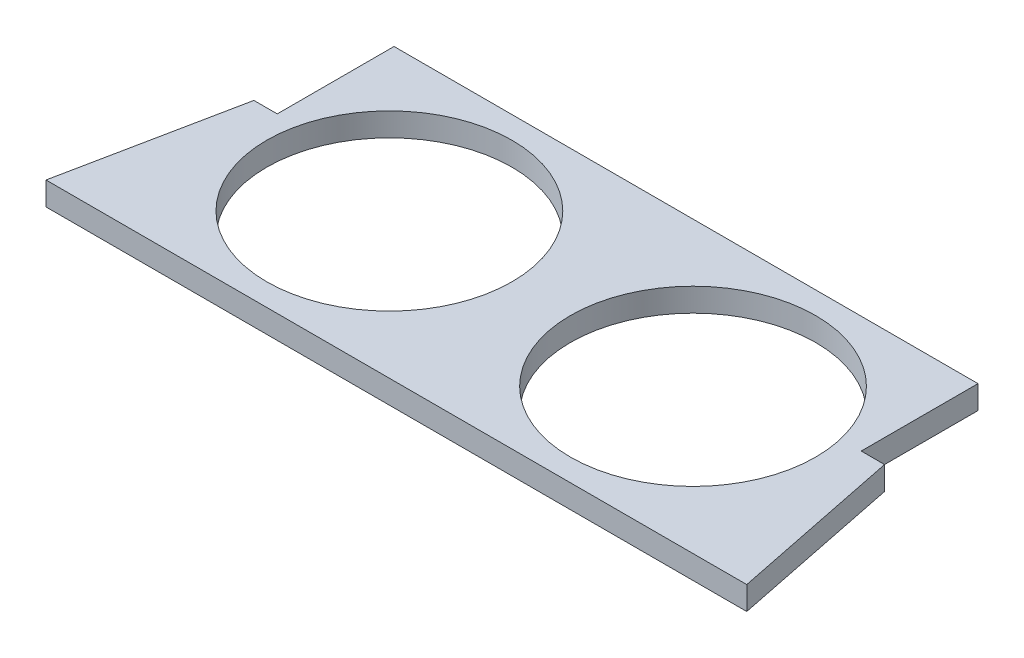
ISO-10303-21;
HEADER;
FILE_DESCRIPTION(('STEP AP214'),'2;1');
FILE_NAME('part.step','',(''),(''),'','','');
FILE_SCHEMA(('AUTOMOTIVE_DESIGN { 1 0 10303 214 1 1 1 1 }'));
ENDSEC;
DATA;
#1=APPLICATION_CONTEXT('core data for automotive mechanical design processes');
#2=APPLICATION_PROTOCOL_DEFINITION('international standard','automotive_design',2000,#1);
#3=PRODUCT_CONTEXT('',#1,'mechanical');
#4=PRODUCT('Part','Part','',(#3));
#5=PRODUCT_RELATED_PRODUCT_CATEGORY('part','',(#4));
#6=PRODUCT_DEFINITION_FORMATION('','',#4);
#7=PRODUCT_DEFINITION_CONTEXT('part definition',#1,'design');
#8=PRODUCT_DEFINITION('design','',#6,#7);
#9=PRODUCT_DEFINITION_SHAPE('','',#8);
#10=(LENGTH_UNIT() NAMED_UNIT(*) SI_UNIT(.MILLI.,.METRE.));
#11=(NAMED_UNIT(*) PLANE_ANGLE_UNIT() SI_UNIT($,.RADIAN.));
#12=(NAMED_UNIT(*) SI_UNIT($,.STERADIAN.) SOLID_ANGLE_UNIT());
#13=UNCERTAINTY_MEASURE_WITH_UNIT(LENGTH_MEASURE(1.E-05),#10,'distance_accuracy_value','');
#14=(GEOMETRIC_REPRESENTATION_CONTEXT(3) GLOBAL_UNCERTAINTY_ASSIGNED_CONTEXT((#13)) GLOBAL_UNIT_ASSIGNED_CONTEXT((#10,
#11,#12)) REPRESENTATION_CONTEXT('',''));
#15=CARTESIAN_POINT('',(0.,0.,0.));
#16=DIRECTION('',(0.,0.,1.));
#17=DIRECTION('',(1.,0.,0.));
#18=AXIS2_PLACEMENT_3D('',#15,#16,#17);
#19=CARTESIAN_POINT('',(0.,10.,0.));
#20=DIRECTION('',(0.,-1.,0.));
#21=DIRECTION('',(0.,0.,-1.));
#22=AXIS2_PLACEMENT_3D('',#19,#20,#21);
#23=PLANE('',#22);
#24=DIRECTION('',(0.198662427795257,0.,0.980067977123268));
#25=VECTOR('',#24,1.);
#26=CARTESIAN_POINT('',(270.,10.,-24.));
#27=LINE('',#26,#25);
#28=CARTESIAN_POINT('',(300.,10.,124.));
#29=VERTEX_POINT('',#28);
#30=CARTESIAN_POINT('',(270.,10.,-24.));
#31=VERTEX_POINT('',#30);
#32=EDGE_CURVE('E96',#29,#31,#27,.F.);
#33=ORIENTED_EDGE('',*,*,#32,.T.);
#34=DIRECTION('',(1.,0.,0.));
#35=VECTOR('',#34,1.);
#36=CARTESIAN_POINT('',(250.,10.,-24.));
#37=LINE('',#36,#35);
#38=CARTESIAN_POINT('',(250.,10.,-24.));
#39=VERTEX_POINT('',#38);
#40=EDGE_CURVE('E79',#31,#39,#37,.F.);
#41=ORIENTED_EDGE('',*,*,#40,.T.);
#42=DIRECTION('',(0.,0.,1.));
#43=VECTOR('',#42,1.);
#44=CARTESIAN_POINT('',(250.,10.,124.));
#45=LINE('',#44,#43);
#46=CARTESIAN_POINT('',(250.,10.,-124.));
#47=VERTEX_POINT('',#46);
#48=EDGE_CURVE('E84',#39,#47,#45,.F.);
#49=ORIENTED_EDGE('',*,*,#48,.T.);
#50=DIRECTION('',(1.,0.,0.));
#51=VECTOR('',#50,1.);
#52=CARTESIAN_POINT('',(-250.,10.,-124.));
#53=LINE('',#52,#51);
#54=CARTESIAN_POINT('',(-250.,10.,-124.));
#55=VERTEX_POINT('',#54);
#56=EDGE_CURVE('E268',#47,#55,#53,.F.);
#57=ORIENTED_EDGE('',*,*,#56,.T.);
#58=DIRECTION('',(0.,0.,-1.));
#59=VECTOR('',#58,1.);
#60=CARTESIAN_POINT('',(-250.,10.,124.));
#61=LINE('',#60,#59);
#62=CARTESIAN_POINT('',(-250.,10.,-24.));
#63=VERTEX_POINT('',#62);
#64=EDGE_CURVE('E273',#55,#63,#61,.F.);
#65=ORIENTED_EDGE('',*,*,#64,.T.);
#66=DIRECTION('',(-1.,0.,0.));
#67=VECTOR('',#66,1.);
#68=CARTESIAN_POINT('',(-250.,10.,-24.));
#69=LINE('',#68,#67);
#70=CARTESIAN_POINT('',(-270.,10.,-24.));
#71=VERTEX_POINT('',#70);
#72=EDGE_CURVE('E278',#71,#63,#69,.F.);
#73=ORIENTED_EDGE('',*,*,#72,.F.);
#74=DIRECTION('',(-0.198662427795257,0.,0.980067977123268));
#75=VECTOR('',#74,1.);
#76=CARTESIAN_POINT('',(-270.,10.,-24.));
#77=LINE('',#76,#75);
#78=CARTESIAN_POINT('',(-300.,10.,124.));
#79=VERTEX_POINT('',#78);
#80=EDGE_CURVE('E251',#79,#71,#77,.F.);
#81=ORIENTED_EDGE('',*,*,#80,.F.);
#82=DIRECTION('',(-1.,0.,0.));
#83=VECTOR('',#82,1.);
#84=CARTESIAN_POINT('',(-250.,10.,124.));
#85=LINE('',#84,#83);
#86=EDGE_CURVE('E252',#79,#29,#85,.F.);
#87=ORIENTED_EDGE('',*,*,#86,.T.);
#88=EDGE_LOOP('',(#33,#41,#49,#57,#65,#73,#81,#87));
#89=FACE_BOUND('',#88,.T.);
#90=CARTESIAN_POINT('',(130.,10.,0.));
#91=DIRECTION('',(0.,1.,0.));
#92=DIRECTION('',(0.,0.,1.));
#93=AXIS2_PLACEMENT_3D('',#90,#91,#92);
#94=CIRCLE('',#93,105.);
#95=CARTESIAN_POINT('',(130.,10.,105.));
#96=VERTEX_POINT('',#95);
#97=EDGE_CURVE('E92',#96,#96,#94,.F.);
#98=ORIENTED_EDGE('',*,*,#97,.T.);
#99=EDGE_LOOP('',(#98));
#100=FACE_BOUND('',#99,.T.);
#101=CARTESIAN_POINT('',(-130.,10.,0.));
#102=DIRECTION('',(0.,1.,0.));
#103=DIRECTION('',(0.,0.,1.));
#104=AXIS2_PLACEMENT_3D('',#101,#102,#103);
#105=CIRCLE('',#104,105.);
#106=CARTESIAN_POINT('',(-130.,10.,105.));
#107=VERTEX_POINT('',#106);
#108=EDGE_CURVE('E19',#107,#107,#105,.F.);
#109=ORIENTED_EDGE('',*,*,#108,.T.);
#110=EDGE_LOOP('',(#109));
#111=FACE_BOUND('',#110,.T.);
#112=ADVANCED_FACE('F16',(#89,#100,#111),#23,.F.);
#113=CARTESIAN_POINT('',(-130.,-10.,0.));
#114=DIRECTION('',(0.,1.,0.));
#115=DIRECTION('',(0.,0.,1.));
#116=AXIS2_PLACEMENT_3D('',#113,#114,#115);
#117=CYLINDRICAL_SURFACE('',#116,105.);
#118=ORIENTED_EDGE('',*,*,#108,.F.);
#119=EDGE_LOOP('',(#118));
#120=FACE_BOUND('',#119,.T.);
#121=CARTESIAN_POINT('',(-130.,-10.,0.));
#122=DIRECTION('',(0.,1.,0.));
#123=DIRECTION('',(0.,0.,1.));
#124=AXIS2_PLACEMENT_3D('',#121,#122,#123);
#125=CIRCLE('',#124,105.);
#126=CARTESIAN_POINT('',(-130.,-10.,105.));
#127=VERTEX_POINT('',#126);
#128=EDGE_CURVE('E111',#127,#127,#125,.T.);
#129=ORIENTED_EDGE('',*,*,#128,.F.);
#130=EDGE_LOOP('',(#129));
#131=FACE_BOUND('',#130,.T.);
#132=ADVANCED_FACE('F119',(#120,#131),#117,.F.);
#133=CARTESIAN_POINT('',(130.,-10.,0.));
#134=DIRECTION('',(0.,1.,0.));
#135=DIRECTION('',(0.,0.,1.));
#136=AXIS2_PLACEMENT_3D('',#133,#134,#135);
#137=CYLINDRICAL_SURFACE('',#136,105.);
#138=ORIENTED_EDGE('',*,*,#97,.F.);
#139=EDGE_LOOP('',(#138));
#140=FACE_BOUND('',#139,.T.);
#141=CARTESIAN_POINT('',(130.,-10.,0.));
#142=DIRECTION('',(0.,1.,0.));
#143=DIRECTION('',(0.,0.,1.));
#144=AXIS2_PLACEMENT_3D('',#141,#142,#143);
#145=CIRCLE('',#144,105.);
#146=CARTESIAN_POINT('',(130.,-10.,105.));
#147=VERTEX_POINT('',#146);
#148=EDGE_CURVE('E107',#147,#147,#145,.T.);
#149=ORIENTED_EDGE('',*,*,#148,.F.);
#150=EDGE_LOOP('',(#149));
#151=FACE_BOUND('',#150,.T.);
#152=ADVANCED_FACE('F122',(#140,#151),#137,.F.);
#153=CARTESIAN_POINT('',(250.,10.,124.));
#154=DIRECTION('',(-1.,0.,0.));
#155=DIRECTION('',(0.,0.,1.));
#156=AXIS2_PLACEMENT_3D('',#153,#154,#155);
#157=PLANE('',#156);
#158=DIRECTION('',(0.,0.,-1.));
#159=VECTOR('',#158,1.);
#160=CARTESIAN_POINT('',(250.,-10.,0.));
#161=LINE('',#160,#159);
#162=CARTESIAN_POINT('',(250.,-10.,-124.));
#163=VERTEX_POINT('',#162);
#164=CARTESIAN_POINT('',(250.,-10.,-24.));
#165=VERTEX_POINT('',#164);
#166=EDGE_CURVE('E110',#163,#165,#161,.F.);
#167=ORIENTED_EDGE('',*,*,#166,.F.);
#168=DIRECTION('',(0.,1.,0.));
#169=VECTOR('',#168,1.);
#170=CARTESIAN_POINT('',(250.,10.,-124.));
#171=LINE('',#170,#169);
#172=EDGE_CURVE('E89',#163,#47,#171,.T.);
#173=ORIENTED_EDGE('',*,*,#172,.T.);
#174=ORIENTED_EDGE('',*,*,#48,.F.);
#175=DIRECTION('',(0.,1.,0.));
#176=VECTOR('',#175,1.);
#177=CARTESIAN_POINT('',(250.,-10.,-24.));
#178=LINE('',#177,#176);
#179=EDGE_CURVE('E86',#39,#165,#178,.F.);
#180=ORIENTED_EDGE('',*,*,#179,.T.);
#181=EDGE_LOOP('',(#167,#173,#174,#180));
#182=FACE_BOUND('',#181,.T.);
#183=ADVANCED_FACE('F85',(#182),#157,.F.);
#184=CARTESIAN_POINT('',(250.,-10.,-24.));
#185=DIRECTION('',(0.,0.,1.));
#186=DIRECTION('',(1.,0.,0.));
#187=AXIS2_PLACEMENT_3D('',#184,#185,#186);
#188=PLANE('',#187);
#189=DIRECTION('',(0.,1.,0.));
#190=VECTOR('',#189,1.);
#191=CARTESIAN_POINT('',(270.,-10.,-24.));
#192=LINE('',#191,#190);
#193=CARTESIAN_POINT('',(270.,-10.,-24.));
#194=VERTEX_POINT('',#193);
#195=EDGE_CURVE('E98',#31,#194,#192,.F.);
#196=ORIENTED_EDGE('',*,*,#195,.T.);
#197=DIRECTION('',(1.,0.,0.));
#198=VECTOR('',#197,1.);
#199=CARTESIAN_POINT('',(0.,-10.,-24.));
#200=LINE('',#199,#198);
#201=EDGE_CURVE('E102',#165,#194,#200,.T.);
#202=ORIENTED_EDGE('',*,*,#201,.F.);
#203=ORIENTED_EDGE('',*,*,#179,.F.);
#204=ORIENTED_EDGE('',*,*,#40,.F.);
#205=EDGE_LOOP('',(#196,#202,#203,#204));
#206=FACE_BOUND('',#205,.T.);
#207=ADVANCED_FACE('F100',(#206),#188,.F.);
#208=CARTESIAN_POINT('',(270.,-10.,-24.));
#209=DIRECTION('',(-0.980067977123268,0.,0.198662427795257));
#210=DIRECTION('',(0.198662427795257,0.,0.980067977123268));
#211=AXIS2_PLACEMENT_3D('',#208,#209,#210);
#212=PLANE('',#211);
#213=DIRECTION('',(0.,1.,0.));
#214=VECTOR('',#213,1.);
#215=CARTESIAN_POINT('',(300.,10.,124.));
#216=LINE('',#215,#214);
#217=CARTESIAN_POINT('',(300.,-10.,124.));
#218=VERTEX_POINT('',#217);
#219=EDGE_CURVE('E246',#29,#218,#216,.F.);
#220=ORIENTED_EDGE('',*,*,#219,.T.);
#221=DIRECTION('',(0.198662427795257,0.,0.980067977123268));
#222=VECTOR('',#221,1.);
#223=CARTESIAN_POINT('',(270.,-10.,-24.));
#224=LINE('',#223,#222);
#225=EDGE_CURVE('E249',#194,#218,#224,.T.);
#226=ORIENTED_EDGE('',*,*,#225,.F.);
#227=ORIENTED_EDGE('',*,*,#195,.F.);
#228=ORIENTED_EDGE('',*,*,#32,.F.);
#229=EDGE_LOOP('',(#220,#226,#227,#228));
#230=FACE_BOUND('',#229,.T.);
#231=ADVANCED_FACE('F154',(#230),#212,.F.);
#232=CARTESIAN_POINT('',(-250.,10.,124.));
#233=DIRECTION('',(0.,0.,-1.));
#234=DIRECTION('',(-1.,0.,0.));
#235=AXIS2_PLACEMENT_3D('',#232,#233,#234);
#236=PLANE('',#235);
#237=ORIENTED_EDGE('',*,*,#219,.F.);
#238=ORIENTED_EDGE('',*,*,#86,.F.);
#239=DIRECTION('',(0.,1.,0.));
#240=VECTOR('',#239,1.);
#241=CARTESIAN_POINT('',(-300.,-10.,124.));
#242=LINE('',#241,#240);
#243=CARTESIAN_POINT('',(-300.,-10.,124.));
#244=VERTEX_POINT('',#243);
#245=EDGE_CURVE('E257',#244,#79,#242,.T.);
#246=ORIENTED_EDGE('',*,*,#245,.F.);
#247=DIRECTION('',(1.,0.,0.));
#248=VECTOR('',#247,1.);
#249=CARTESIAN_POINT('',(0.,-10.,124.));
#250=LINE('',#249,#248);
#251=EDGE_CURVE('E255',#218,#244,#250,.F.);
#252=ORIENTED_EDGE('',*,*,#251,.F.);
#253=EDGE_LOOP('',(#237,#238,#246,#252));
#254=FACE_BOUND('',#253,.T.);
#255=ADVANCED_FACE('F150',(#254),#236,.F.);
#256=CARTESIAN_POINT('',(-270.,-10.,-24.));
#257=DIRECTION('',(-0.980067977123268,0.,-0.198662427795257));
#258=DIRECTION('',(-0.198662427795257,0.,0.980067977123268));
#259=AXIS2_PLACEMENT_3D('',#256,#257,#258);
#260=PLANE('',#259);
#261=DIRECTION('',(0.198662427795257,0.,-0.980067977123268));
#262=VECTOR('',#261,1.);
#263=CARTESIAN_POINT('',(-300.,-10.,124.));
#264=LINE('',#263,#262);
#265=CARTESIAN_POINT('',(-270.,-10.,-24.));
#266=VERTEX_POINT('',#265);
#267=EDGE_CURVE('E260',#244,#266,#264,.T.);
#268=ORIENTED_EDGE('',*,*,#267,.F.);
#269=ORIENTED_EDGE('',*,*,#245,.T.);
#270=ORIENTED_EDGE('',*,*,#80,.T.);
#271=DIRECTION('',(0.,1.,0.));
#272=VECTOR('',#271,1.);
#273=CARTESIAN_POINT('',(-270.,-10.,-24.));
#274=LINE('',#273,#272);
#275=EDGE_CURVE('E275',#266,#71,#274,.T.);
#276=ORIENTED_EDGE('',*,*,#275,.F.);
#277=EDGE_LOOP('',(#268,#269,#270,#276));
#278=FACE_BOUND('',#277,.T.);
#279=ADVANCED_FACE('F146',(#278),#260,.T.);
#280=CARTESIAN_POINT('',(-250.,-10.,-24.));
#281=DIRECTION('',(0.,0.,-1.));
#282=DIRECTION('',(-1.,0.,0.));
#283=AXIS2_PLACEMENT_3D('',#280,#281,#282);
#284=PLANE('',#283);
#285=DIRECTION('',(1.,0.,0.));
#286=VECTOR('',#285,1.);
#287=CARTESIAN_POINT('',(0.,-10.,-24.));
#288=LINE('',#287,#286);
#289=CARTESIAN_POINT('',(-250.,-10.,-24.));
#290=VERTEX_POINT('',#289);
#291=EDGE_CURVE('E287',#266,#290,#288,.T.);
#292=ORIENTED_EDGE('',*,*,#291,.F.);
#293=ORIENTED_EDGE('',*,*,#275,.T.);
#294=ORIENTED_EDGE('',*,*,#72,.T.);
#295=DIRECTION('',(0.,1.,0.));
#296=VECTOR('',#295,1.);
#297=CARTESIAN_POINT('',(-250.,10.,-24.));
#298=LINE('',#297,#296);
#299=EDGE_CURVE('E271',#63,#290,#298,.F.);
#300=ORIENTED_EDGE('',*,*,#299,.T.);
#301=EDGE_LOOP('',(#292,#293,#294,#300));
#302=FACE_BOUND('',#301,.T.);
#303=ADVANCED_FACE('F143',(#302),#284,.T.);
#304=CARTESIAN_POINT('',(-250.,10.,124.));
#305=DIRECTION('',(1.,0.,0.));
#306=DIRECTION('',(0.,0.,-1.));
#307=AXIS2_PLACEMENT_3D('',#304,#305,#306);
#308=PLANE('',#307);
#309=ORIENTED_EDGE('',*,*,#299,.F.);
#310=ORIENTED_EDGE('',*,*,#64,.F.);
#311=DIRECTION('',(0.,1.,0.));
#312=VECTOR('',#311,1.);
#313=CARTESIAN_POINT('',(-250.,10.,-124.));
#314=LINE('',#313,#312);
#315=CARTESIAN_POINT('',(-250.,-10.,-124.));
#316=VERTEX_POINT('',#315);
#317=EDGE_CURVE('E34',#55,#316,#314,.F.);
#318=ORIENTED_EDGE('',*,*,#317,.T.);
#319=DIRECTION('',(0.,0.,-1.));
#320=VECTOR('',#319,1.);
#321=CARTESIAN_POINT('',(-250.,-10.,0.));
#322=LINE('',#321,#320);
#323=EDGE_CURVE('E25',#290,#316,#322,.T.);
#324=ORIENTED_EDGE('',*,*,#323,.F.);
#325=EDGE_LOOP('',(#309,#310,#318,#324));
#326=FACE_BOUND('',#325,.T.);
#327=ADVANCED_FACE('F135',(#326),#308,.F.);
#328=CARTESIAN_POINT('',(-250.,10.,-124.));
#329=DIRECTION('',(0.,0.,1.));
#330=DIRECTION('',(1.,0.,0.));
#331=AXIS2_PLACEMENT_3D('',#328,#329,#330);
#332=PLANE('',#331);
#333=ORIENTED_EDGE('',*,*,#317,.F.);
#334=ORIENTED_EDGE('',*,*,#56,.F.);
#335=ORIENTED_EDGE('',*,*,#172,.F.);
#336=DIRECTION('',(1.,0.,0.));
#337=VECTOR('',#336,1.);
#338=CARTESIAN_POINT('',(0.,-10.,-124.));
#339=LINE('',#338,#337);
#340=EDGE_CURVE('E11',#316,#163,#339,.T.);
#341=ORIENTED_EDGE('',*,*,#340,.F.);
#342=EDGE_LOOP('',(#333,#334,#335,#341));
#343=FACE_BOUND('',#342,.T.);
#344=ADVANCED_FACE('F127',(#343),#332,.F.);
#345=CARTESIAN_POINT('',(0.,-10.,0.));
#346=DIRECTION('',(0.,-1.,0.));
#347=DIRECTION('',(0.,0.,-1.));
#348=AXIS2_PLACEMENT_3D('',#345,#346,#347);
#349=PLANE('',#348);
#350=ORIENTED_EDGE('',*,*,#323,.T.);
#351=ORIENTED_EDGE('',*,*,#340,.T.);
#352=ORIENTED_EDGE('',*,*,#166,.T.);
#353=ORIENTED_EDGE('',*,*,#201,.T.);
#354=ORIENTED_EDGE('',*,*,#225,.T.);
#355=ORIENTED_EDGE('',*,*,#251,.T.);
#356=ORIENTED_EDGE('',*,*,#267,.T.);
#357=ORIENTED_EDGE('',*,*,#291,.T.);
#358=EDGE_LOOP('',(#350,#351,#352,#353,#354,#355,#356,#357));
#359=FACE_BOUND('',#358,.T.);
#360=ORIENTED_EDGE('',*,*,#148,.T.);
#361=EDGE_LOOP('',(#360));
#362=FACE_BOUND('',#361,.T.);
#363=ORIENTED_EDGE('',*,*,#128,.T.);
#364=EDGE_LOOP('',(#363));
#365=FACE_BOUND('',#364,.T.);
#366=ADVANCED_FACE('F125',(#359,#362,#365),#349,.T.);
#367=CLOSED_SHELL('',(#112,#132,#152,#183,#207,#231,#255,#279,#303,#327,#344,#366));
#368=MANIFOLD_SOLID_BREP('B1',#367);
#369=ADVANCED_BREP_SHAPE_REPRESENTATION('',(#18,#368),#14);
#370=SHAPE_DEFINITION_REPRESENTATION(#9,#369);
ENDSEC;
END-ISO-10303-21;
